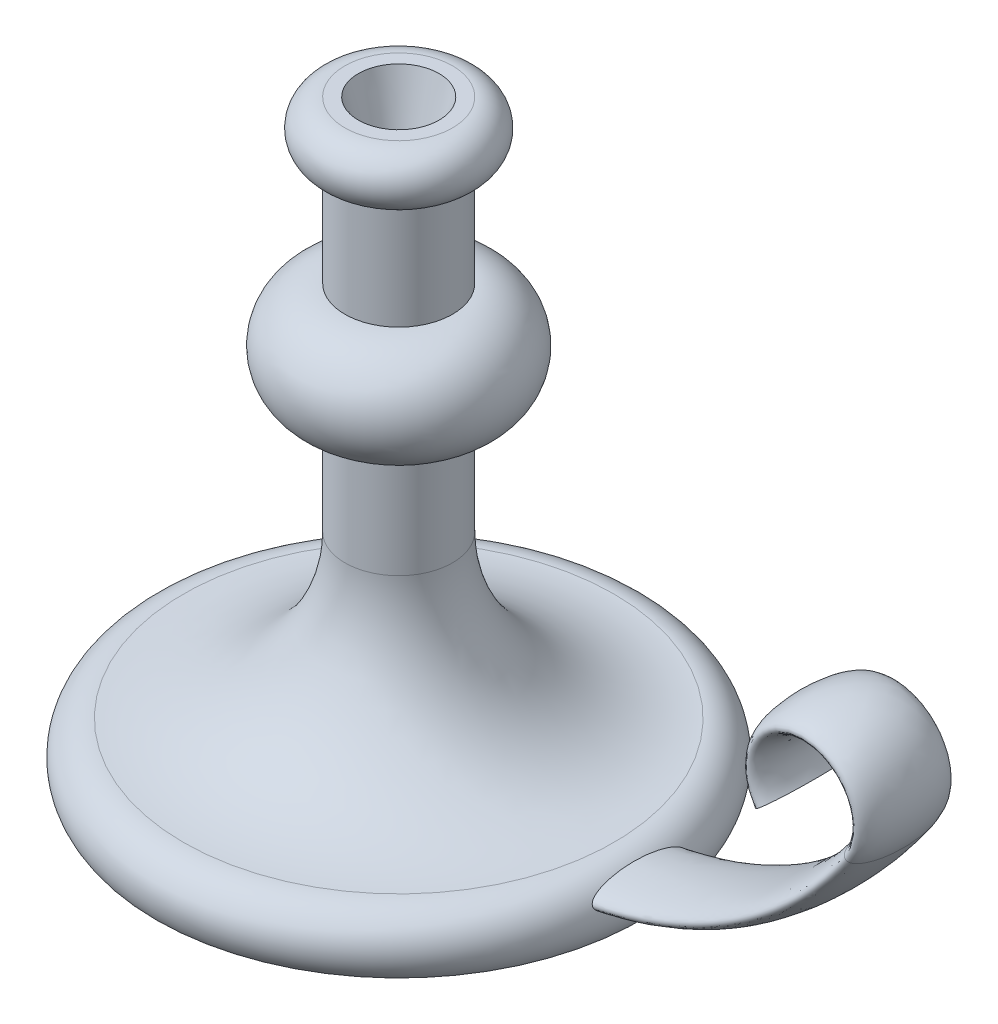
ISO-10303-21;
HEADER;
FILE_DESCRIPTION(('STEP AP214'),'2;1');
FILE_NAME('part.step','',(''),(''),'','','');
FILE_SCHEMA(('AUTOMOTIVE_DESIGN { 1 0 10303 214 1 1 1 1 }'));
ENDSEC;
DATA;
#1=APPLICATION_CONTEXT('core data for automotive mechanical design processes');
#2=APPLICATION_PROTOCOL_DEFINITION('international standard','automotive_design',2000,#1);
#3=PRODUCT_CONTEXT('',#1,'mechanical');
#4=PRODUCT('Part','Part','',(#3));
#5=PRODUCT_RELATED_PRODUCT_CATEGORY('part','',(#4));
#6=PRODUCT_DEFINITION_FORMATION('','',#4);
#7=PRODUCT_DEFINITION_CONTEXT('part definition',#1,'design');
#8=PRODUCT_DEFINITION('design','',#6,#7);
#9=PRODUCT_DEFINITION_SHAPE('','',#8);
#10=(LENGTH_UNIT() NAMED_UNIT(*) SI_UNIT(.MILLI.,.METRE.));
#11=(NAMED_UNIT(*) PLANE_ANGLE_UNIT() SI_UNIT($,.RADIAN.));
#12=(NAMED_UNIT(*) SI_UNIT($,.STERADIAN.) SOLID_ANGLE_UNIT());
#13=UNCERTAINTY_MEASURE_WITH_UNIT(LENGTH_MEASURE(1.E-05),#10,'distance_accuracy_value','');
#14=(GEOMETRIC_REPRESENTATION_CONTEXT(3) GLOBAL_UNCERTAINTY_ASSIGNED_CONTEXT((#13)) GLOBAL_UNIT_ASSIGNED_CONTEXT((#10,
#11,#12)) REPRESENTATION_CONTEXT('',''));
#15=CARTESIAN_POINT('',(0.,0.,0.));
#16=DIRECTION('',(0.,0.,1.));
#17=DIRECTION('',(1.,0.,0.));
#18=AXIS2_PLACEMENT_3D('',#15,#16,#17);
#19=CARTESIAN_POINT('',(0.,0.,0.));
#20=DIRECTION('',(0.,-1.,0.));
#21=DIRECTION('',(0.,0.,-1.));
#22=AXIS2_PLACEMENT_3D('',#19,#20,#21);
#23=PLANE('',#22);
#24=CARTESIAN_POINT('',(0.,0.,0.));
#25=DIRECTION('',(0.,-1.,0.));
#26=DIRECTION('',(0.,0.,-1.));
#27=AXIS2_PLACEMENT_3D('',#24,#25,#26);
#28=CIRCLE('',#27,90.);
#29=CARTESIAN_POINT('',(0.,0.,-90.));
#30=VERTEX_POINT('',#29);
#31=EDGE_CURVE('E83',#30,#30,#28,.T.);
#32=ORIENTED_EDGE('',*,*,#31,.T.);
#33=EDGE_LOOP('',(#32));
#34=FACE_BOUND('',#33,.T.);
#35=ADVANCED_FACE('F50',(#34),#23,.T.);
#36=CARTESIAN_POINT('',(0.,220.,0.));
#37=DIRECTION('',(0.,1.,0.));
#38=DIRECTION('',(0.,0.,1.));
#39=AXIS2_PLACEMENT_3D('',#36,#37,#38);
#40=PLANE('',#39);
#41=CARTESIAN_POINT('',(0.,220.,0.));
#42=DIRECTION('',(0.,1.,0.));
#43=DIRECTION('',(0.,0.,1.));
#44=AXIS2_PLACEMENT_3D('',#41,#42,#43);
#45=CIRCLE('',#44,15.);
#46=CARTESIAN_POINT('',(0.,220.,15.));
#47=VERTEX_POINT('',#46);
#48=EDGE_CURVE('E95',#47,#47,#45,.T.);
#49=ORIENTED_EDGE('',*,*,#48,.F.);
#50=EDGE_LOOP('',(#49));
#51=FACE_BOUND('',#50,.T.);
#52=CARTESIAN_POINT('',(0.,220.,0.));
#53=DIRECTION('',(0.,-1.,0.));
#54=DIRECTION('',(0.,0.,-1.));
#55=AXIS2_PLACEMENT_3D('',#52,#53,#54);
#56=CIRCLE('',#55,20.);
#57=CARTESIAN_POINT('',(0.,220.,-20.));
#58=VERTEX_POINT('',#57);
#59=EDGE_CURVE('E61',#58,#58,#56,.T.);
#60=ORIENTED_EDGE('',*,*,#59,.F.);
#61=EDGE_LOOP('',(#60));
#62=FACE_BOUND('',#61,.T.);
#63=ADVANCED_FACE('F101',(#51,#62),#40,.T.);
#64=CARTESIAN_POINT('',(0.,210.,0.));
#65=DIRECTION('',(0.,-1.,0.));
#66=DIRECTION('',(0.,0.,-1.));
#67=AXIS2_PLACEMENT_3D('',#64,#65,#66);
#68=TOROIDAL_SURFACE('',#67,20.,10.);
#69=ORIENTED_EDGE('',*,*,#59,.T.);
#70=EDGE_LOOP('',(#69));
#71=FACE_BOUND('',#70,.T.);
#72=CARTESIAN_POINT('',(0.,200.,0.));
#73=DIRECTION('',(0.,-1.,0.));
#74=DIRECTION('',(0.,0.,-1.));
#75=AXIS2_PLACEMENT_3D('',#72,#73,#74);
#76=CIRCLE('',#75,20.);
#77=CARTESIAN_POINT('',(0.,200.,-20.));
#78=VERTEX_POINT('',#77);
#79=EDGE_CURVE('E65',#78,#78,#76,.T.);
#80=ORIENTED_EDGE('',*,*,#79,.F.);
#81=EDGE_LOOP('',(#80));
#82=FACE_BOUND('',#81,.T.);
#83=ADVANCED_FACE('F104',(#71,#82),#68,.T.);
#84=CARTESIAN_POINT('',(0.,0.,0.));
#85=DIRECTION('',(0.,-1.,0.));
#86=DIRECTION('',(0.,0.,-1.));
#87=AXIS2_PLACEMENT_3D('',#84,#85,#86);
#88=CYLINDRICAL_SURFACE('',#87,20.);
#89=ORIENTED_EDGE('',*,*,#79,.T.);
#90=EDGE_LOOP('',(#89));
#91=FACE_BOUND('',#90,.T.);
#92=CARTESIAN_POINT('',(0.,160.,0.));
#93=DIRECTION('',(0.,-1.,0.));
#94=DIRECTION('',(0.,0.,-1.));
#95=AXIS2_PLACEMENT_3D('',#92,#93,#94);
#96=CIRCLE('',#95,20.);
#97=CARTESIAN_POINT('',(0.,160.,-20.));
#98=VERTEX_POINT('',#97);
#99=EDGE_CURVE('E69',#98,#98,#96,.T.);
#100=ORIENTED_EDGE('',*,*,#99,.F.);
#101=EDGE_LOOP('',(#100));
#102=FACE_BOUND('',#101,.T.);
#103=ADVANCED_FACE('F109',(#91,#102),#88,.T.);
#104=CARTESIAN_POINT('',(0.,140.,0.));
#105=DIRECTION('',(0.,-1.,0.));
#106=DIRECTION('',(0.,0.,-1.));
#107=AXIS2_PLACEMENT_3D('',#104,#105,#106);
#108=TOROIDAL_SURFACE('',#107,20.,20.);
#109=ORIENTED_EDGE('',*,*,#99,.T.);
#110=EDGE_LOOP('',(#109));
#111=FACE_BOUND('',#110,.T.);
#112=CARTESIAN_POINT('',(0.,120.,0.));
#113=DIRECTION('',(0.,-1.,0.));
#114=DIRECTION('',(0.,0.,-1.));
#115=AXIS2_PLACEMENT_3D('',#112,#113,#114);
#116=CIRCLE('',#115,20.);
#117=CARTESIAN_POINT('',(0.,120.,-20.));
#118=VERTEX_POINT('',#117);
#119=EDGE_CURVE('E74',#118,#118,#116,.T.);
#120=ORIENTED_EDGE('',*,*,#119,.F.);
#121=EDGE_LOOP('',(#120));
#122=FACE_BOUND('',#121,.T.);
#123=ADVANCED_FACE('F115',(#111,#122),#108,.T.);
#124=CARTESIAN_POINT('',(0.,0.,0.));
#125=DIRECTION('',(0.,-1.,0.));
#126=DIRECTION('',(0.,0.,-1.));
#127=AXIS2_PLACEMENT_3D('',#124,#125,#126);
#128=CYLINDRICAL_SURFACE('',#127,20.);
#129=ORIENTED_EDGE('',*,*,#119,.T.);
#130=EDGE_LOOP('',(#129));
#131=FACE_BOUND('',#130,.T.);
#132=CARTESIAN_POINT('',(0.,80.,0.));
#133=DIRECTION('',(0.,-1.,0.));
#134=DIRECTION('',(0.,0.,-1.));
#135=AXIS2_PLACEMENT_3D('',#132,#133,#134);
#136=CIRCLE('',#135,20.);
#137=CARTESIAN_POINT('',(0.,80.,-20.));
#138=VERTEX_POINT('',#137);
#139=EDGE_CURVE('E77',#138,#138,#136,.T.);
#140=ORIENTED_EDGE('',*,*,#139,.F.);
#141=EDGE_LOOP('',(#140));
#142=FACE_BOUND('',#141,.T.);
#143=ADVANCED_FACE('F119',(#131,#142),#128,.T.);
#144=CARTESIAN_POINT('',(0.,80.,0.));
#145=DIRECTION('',(0.,-1.,0.));
#146=DIRECTION('',(0.,0.,-1.));
#147=AXIS2_PLACEMENT_3D('',#144,#145,#146);
#148=TOROIDAL_SURFACE('',#147,80.,60.);
#149=ORIENTED_EDGE('',*,*,#139,.T.);
#150=EDGE_LOOP('',(#149));
#151=FACE_BOUND('',#150,.T.);
#152=CARTESIAN_POINT('',(0.,20.,0.));
#153=DIRECTION('',(0.,-1.,0.));
#154=DIRECTION('',(0.,0.,-1.));
#155=AXIS2_PLACEMENT_3D('',#152,#153,#154);
#156=CIRCLE('',#155,80.);
#157=CARTESIAN_POINT('',(0.,20.,-80.));
#158=VERTEX_POINT('',#157);
#159=EDGE_CURVE('E80',#158,#158,#156,.T.);
#160=ORIENTED_EDGE('',*,*,#159,.F.);
#161=EDGE_LOOP('',(#160));
#162=FACE_BOUND('',#161,.T.);
#163=ADVANCED_FACE('F123',(#151,#162),#148,.F.);
#164=CARTESIAN_POINT('',(0.,7.49999999999999,0.));
#165=DIRECTION('',(0.,-1.,0.));
#166=DIRECTION('',(0.,0.,-1.));
#167=AXIS2_PLACEMENT_3D('',#164,#165,#166);
#168=TOROIDAL_SURFACE('',#167,80.,12.5);
#169=CARTESIAN_POINT('',(89.5597422043341,12.9414346567555,-17.5));
#170=CARTESIAN_POINT('',(89.5390618403561,12.9834100865229,-17.4999996776707));
#171=CARTESIAN_POINT('',(89.5184817634659,13.0254349004937,-17.4978446678338));
#172=CARTESIAN_POINT('',(89.4776811982743,13.1092324497794,-17.4892861575811));
#173=CARTESIAN_POINT('',(89.457460843071,13.1510050881611,-17.4828811168849));
#174=CARTESIAN_POINT('',(89.3975402811209,13.2754779151414,-17.4575154450276));
#175=CARTESIAN_POINT('',(89.3585808220613,13.357332519418,-17.4324042670614));
#176=CARTESIAN_POINT('',(89.2734407804368,13.5379179993389,-17.3597430943198));
#177=CARTESIAN_POINT('',(89.2281116968574,13.6353152430682,-17.3079906529225));
#178=CARTESIAN_POINT('',(89.1421567137609,13.8217570109409,-17.1881654215547));
#179=CARTESIAN_POINT('',(89.10154096816,13.9107834263932,-17.1200583326704));
#180=CARTESIAN_POINT('',(89.0298799325305,14.0690063055582,-16.9825317839868));
#181=CARTESIAN_POINT('',(88.9982856031081,14.1392491335227,-16.9145677994464));
#182=CARTESIAN_POINT('',(88.9378435588022,14.2742914925202,-16.7722502997375));
#183=CARTESIAN_POINT('',(88.9089980734781,14.3390866000317,-16.6978916893925));
#184=CARTESIAN_POINT('',(88.8536099995593,14.4639626152392,-16.544217780153));
#185=CARTESIAN_POINT('',(88.8270733532936,14.5240313225779,-16.4648905452803));
#186=CARTESIAN_POINT('',(88.7760376587063,14.6398576639347,-16.3025863942461));
#187=CARTESIAN_POINT('',(88.7515379613228,14.6956166708123,-16.219610653644));
#188=CARTESIAN_POINT('',(88.7047328205489,14.8023169553036,-16.052427362784));
#189=CARTESIAN_POINT('',(88.6823939519366,14.8533308765833,-15.9682752160745));
#190=CARTESIAN_POINT('',(88.639155365759,14.9521540950118,-15.7977416210759));
#191=CARTESIAN_POINT('',(88.6182558899721,14.9999628537458,-15.711359801597));
#192=CARTESIAN_POINT('',(88.5573681790008,15.1392585624723,-15.4492483073625));
#193=CARTESIAN_POINT('',(88.5192579811327,15.2264609786255,-15.2707999543232));
#194=CARTESIAN_POINT('',(88.4468979005836,15.3916731276291,-14.9088289385944));
#195=CARTESIAN_POINT('',(88.4126513155026,15.4696750103546,-14.725302105289));
#196=CARTESIAN_POINT('',(88.3471391595039,15.6182965032923,-14.3538259785736));
#197=CARTESIAN_POINT('',(88.3158872528146,15.6888824046966,-14.1658608782527));
#198=CARTESIAN_POINT('',(88.2560127035516,15.8233792512431,-13.7874003918539));
#199=CARTESIAN_POINT('',(88.2273872233002,15.8872974109117,-13.5969079973402));
#200=CARTESIAN_POINT('',(88.1723348827448,16.0094159388249,-13.213849673779));
#201=CARTESIAN_POINT('',(88.1459074726896,16.0676177374301,-13.021284276893));
#202=CARTESIAN_POINT('',(88.0884248304702,16.1932687928886,-12.5849658119247));
#203=CARTESIAN_POINT('',(88.0579162002184,16.2592725226906,-12.3407253521734));
#204=CARTESIAN_POINT('',(87.9994625659013,16.3844358500305,-11.8501803460781));
#205=CARTESIAN_POINT('',(87.9715178234088,16.4435947494061,-11.6038755919222));
#206=CARTESIAN_POINT('',(87.9178897421858,16.5558889779776,-11.1095299870479));
#207=CARTESIAN_POINT('',(87.8922075114269,16.6090213595568,-10.8614883492399));
#208=CARTESIAN_POINT('',(87.8429155378603,16.7098546386226,-10.3640943607017));
#209=CARTESIAN_POINT('',(87.8193058942811,16.7575552760879,-10.114741947821));
#210=CARTESIAN_POINT('',(87.7514718906047,16.8930622945828,-9.36631396644897));
#211=CARTESIAN_POINT('',(87.710111419914,16.97354616682,-8.86564202060311));
#212=CARTESIAN_POINT('',(87.6344118706353,17.1178657179368,-7.86153551840225));
#213=CARTESIAN_POINT('',(87.6000713341079,17.1817048544489,-7.35810155802561));
#214=CARTESIAN_POINT('',(87.5383679228554,17.2943697092708,-6.35225136111871));
#215=CARTESIAN_POINT('',(87.5109639050818,17.3432843238913,-5.84984753787554));
#216=CARTESIAN_POINT('',(87.4628391630611,17.4279603163538,-4.84354228831008));
#217=CARTESIAN_POINT('',(87.4421195253372,17.4637195559667,-4.33964063194088));
#218=CARTESIAN_POINT('',(87.4074386787954,17.5229738360405,-3.33084363886012));
#219=CARTESIAN_POINT('',(87.3934780874881,17.5464677559495,-2.8259482155868));
#220=CARTESIAN_POINT('',(87.3724154174235,17.5817273168609,-1.81615213380802));
#221=CARTESIAN_POINT('',(87.3653059747339,17.5935055508652,-1.3112520655452));
#222=CARTESIAN_POINT('',(87.3579750479624,17.6056484066489,-0.301318309132904));
#223=CARTESIAN_POINT('',(87.357752858235,17.6060141977103,0.203715360026094));
#224=CARTESIAN_POINT('',(87.3641963426438,17.5953454261038,1.21356726554169));
#225=CARTESIAN_POINT('',(87.3708612610896,17.5843121142069,1.71838551945508));
#226=CARTESIAN_POINT('',(87.3886163883338,17.554616306541,2.60695068649852));
#227=CARTESIAN_POINT('',(87.3982690399212,17.5384060734754,2.99081046478838));
#228=CARTESIAN_POINT('',(87.4214966880659,17.4990063104014,3.75807002785711));
#229=CARTESIAN_POINT('',(87.435071823598,17.4758165331044,4.14146979585427));
#230=CARTESIAN_POINT('',(87.4661109016121,17.4221255760208,4.90767543763208));
#231=CARTESIAN_POINT('',(87.4835755913649,17.3916229911934,5.29048118303758));
#232=CARTESIAN_POINT('',(87.5224765269599,17.3226675403927,6.05728766608034));
#233=CARTESIAN_POINT('',(87.5439339089184,17.2841722314846,6.44128353835439));
#234=CARTESIAN_POINT('',(87.5907685418077,17.1987228636429,7.20803081067555));
#235=CARTESIAN_POINT('',(87.6161451191905,17.1517702579396,7.59078241304229));
#236=CARTESIAN_POINT('',(87.6708875244928,17.0486132676472,8.35453102594113));
#237=CARTESIAN_POINT('',(87.7002509792864,16.9924143825779,8.73552894189134));
#238=CARTESIAN_POINT('',(87.7555693385741,16.8844873931684,9.40362807317344));
#239=CARTESIAN_POINT('',(87.7806318626291,16.8349635590469,9.6911595586556));
#240=CARTESIAN_POINT('',(87.8333287645207,16.7293167465828,10.2648242071222));
#241=CARTESIAN_POINT('',(87.8609635304672,16.6731927720484,10.5509571522122));
#242=CARTESIAN_POINT('',(87.9190678138249,16.5534902310351,11.1217112831612));
#243=CARTESIAN_POINT('',(87.9495404231884,16.4899035134826,11.4063304543324));
#244=CARTESIAN_POINT('',(88.0137266324375,16.3541216812727,11.9738772339476));
#245=CARTESIAN_POINT('',(88.0474477220507,16.2819065762202,12.2567992545898));
#246=CARTESIAN_POINT('',(88.1183718381953,16.1280994435204,12.8175821097588));
#247=CARTESIAN_POINT('',(88.1555499028383,16.046573796357,13.0954641920682));
#248=CARTESIAN_POINT('',(88.2343580118385,15.8719007074313,13.6468218234687));
#249=CARTESIAN_POINT('',(88.2759857295858,15.7787593350285,13.9202995902182));
#250=CARTESIAN_POINT('',(88.3426568223939,15.6283840406489,14.3254052817092));
#251=CARTESIAN_POINT('',(88.3655500017785,15.5765627213432,14.459402316928));
#252=CARTESIAN_POINT('',(88.4129882653633,15.4688611687535,14.7254525655375));
#253=CARTESIAN_POINT('',(88.437533168995,15.4129813790936,14.8575059894887));
#254=CARTESIAN_POINT('',(88.4884967907572,15.296726972035,15.1188747284343));
#255=CARTESIAN_POINT('',(88.5149109123158,15.2363633637366,15.2481958098579));
#256=CARTESIAN_POINT('',(88.5700241751771,15.1103179001212,15.5037035642081));
#257=CARTESIAN_POINT('',(88.5987227483178,15.0446373670989,15.6298910063173));
#258=CARTESIAN_POINT('',(88.6570151826478,14.9113179601609,15.8704199707059));
#259=CARTESIAN_POINT('',(88.686441736786,14.8440563407289,15.985009599526));
#260=CARTESIAN_POINT('',(88.7482816567767,14.7030103830826,16.2094581395952));
#261=CARTESIAN_POINT('',(88.780697475614,14.6292206899981,16.3193130551168));
#262=CARTESIAN_POINT('',(88.8489097184972,14.4745639616531,16.5315146626623));
#263=CARTESIAN_POINT('',(88.8846785573508,14.3937550191611,16.6339121024916));
#264=CARTESIAN_POINT('',(88.9606113704152,14.2232561160766,16.8291907541922));
#265=CARTESIAN_POINT('',(89.0007675950252,14.1335818404865,16.9220882016582));
#266=CARTESIAN_POINT('',(89.0601235459872,14.0021924630805,17.0411637727684));
#267=CARTESIAN_POINT('',(89.0770574086404,13.9648250339927,17.0732949178269));
#268=CARTESIAN_POINT('',(89.1117704043089,13.8885105828123,17.1351129203988));
#269=CARTESIAN_POINT('',(89.1295494801998,13.8495636674962,17.1647999427301));
#270=CARTESIAN_POINT('',(89.1842722230347,13.7301865324198,17.2496672583031));
#271=CARTESIAN_POINT('',(89.2225929343976,13.6472387371287,17.3006362954166));
#272=CARTESIAN_POINT('',(89.2830198855204,13.5177923286577,17.3659392171784));
#273=CARTESIAN_POINT('',(89.3038035106325,13.4734899832391,17.385944655127));
#274=CARTESIAN_POINT('',(89.346235727213,13.3835498526412,17.421521231844));
#275=CARTESIAN_POINT('',(89.3678838017235,13.3379128698458,17.4370949768747));
#276=CARTESIAN_POINT('',(89.411904802424,13.2456714845448,17.4633118273198));
#277=CARTESIAN_POINT('',(89.4342765183816,13.1990687398024,17.4739627514632));
#278=CARTESIAN_POINT('',(89.4796070415906,13.1052444737537,17.4900003628641));
#279=CARTESIAN_POINT('',(89.5025657624808,13.0580230439623,17.495387819971));
#280=CARTESIAN_POINT('',(89.5464271716018,12.9684112208445,17.5004320668286));
#281=CARTESIAN_POINT('',(89.5672934245651,12.9260327119426,17.5006298436875));
#282=CARTESIAN_POINT('',(89.6091580078856,12.8415284156484,17.496667300483));
#283=CARTESIAN_POINT('',(89.6301563797468,12.7994027167221,17.4925055351934));
#284=CARTESIAN_POINT('',(89.672115635143,12.7157496198108,17.479965082583));
#285=CARTESIAN_POINT('',(89.6930765014329,12.6742224548788,17.4715847960013));
#286=CARTESIAN_POINT('',(89.7348115258834,12.5920532516239,17.4508625220261));
#287=CARTESIAN_POINT('',(89.7555855765781,12.5514117057388,17.4385183877269));
#288=CARTESIAN_POINT('',(89.8013847331777,12.4623676182577,17.4070626989759));
#289=CARTESIAN_POINT('',(89.8263321178974,12.4142402057079,17.3870577635768));
#290=CARTESIAN_POINT('',(89.8756026524762,12.3198942829529,17.3423007335128));
#291=CARTESIAN_POINT('',(89.8999253272692,12.2736772101064,17.317545140678));
#292=CARTESIAN_POINT('',(89.9718636752115,12.1379719567039,17.2371059859825));
#293=CARTESIAN_POINT('',(90.0184026508768,12.051520920799,17.1752845379973));
#294=CARTESIAN_POINT('',(90.1015176697337,11.8991704299987,17.0502729237444));
#295=CARTESIAN_POINT('',(90.1385373685484,11.832138329749,16.9886971231214));
#296=CARTESIAN_POINT('',(90.2104869329279,11.7032426034952,16.8591573255862));
#297=CARTESIAN_POINT('',(90.2454151408799,11.641383062009,16.7911883686367));
#298=CARTESIAN_POINT('',(90.3133841124365,11.5222099067343,16.6502911436158));
#299=CARTESIAN_POINT('',(90.3464212107124,11.4649050425,16.577353807455));
#300=CARTESIAN_POINT('',(90.4107258034174,11.3544143267812,16.427734996584));
#301=CARTESIAN_POINT('',(90.441993749758,11.3012274221163,16.3510544874358));
#302=CARTESIAN_POINT('',(90.5066142435688,11.1922810586096,16.185318952537));
#303=CARTESIAN_POINT('',(90.5397652495639,11.1369814833086,16.0958847835331));
#304=CARTESIAN_POINT('',(90.6043042941241,11.0303194621557,15.9140859303206));
#305=CARTESIAN_POINT('',(90.6356921559875,10.978957410734,15.8217209538336));
#306=CARTESIAN_POINT('',(90.696838387797,10.8797698841651,15.6347974994414));
#307=CARTESIAN_POINT('',(90.7265992701636,10.8319389137698,15.540242744142));
#308=CARTESIAN_POINT('',(90.7846969346251,10.7393295137681,15.3492353522605));
#309=CARTESIAN_POINT('',(90.8130337948203,10.6945509167066,15.2527828201664));
#310=CARTESIAN_POINT('',(90.8771212205239,10.5940589597549,15.0277319837683));
#311=CARTESIAN_POINT('',(90.9124022819657,10.5393328792865,14.8985593440141));
#312=CARTESIAN_POINT('',(90.9809741103801,10.4339610325184,14.6380328432609));
#313=CARTESIAN_POINT('',(91.0142645951402,10.3833158444317,14.5066786763347));
#314=CARTESIAN_POINT('',(91.1115171918212,10.2366440116077,14.1096810918781));
#315=CARTESIAN_POINT('',(91.1727828792965,10.1460018602114,13.8413800425919));
#316=CARTESIAN_POINT('',(91.289286281246,9.97615455726914,13.2997906638459));
#317=CARTESIAN_POINT('',(91.3445203789087,9.89695625887038,13.0264994554536));
#318=CARTESIAN_POINT('',(91.449980571998,9.74769654866267,12.4748594155948));
#319=CARTESIAN_POINT('',(91.5001780442572,9.6776867307802,12.1964912536698));
#320=CARTESIAN_POINT('',(91.5957501918067,9.54592534416388,11.6372393425744));
#321=CARTESIAN_POINT('',(91.6411285723793,9.48416742117631,11.3563577087906));
#322=CARTESIAN_POINT('',(91.7275132616963,9.36779787162549,10.7925089006676));
#323=CARTESIAN_POINT('',(91.7685202729419,9.31318509647924,10.5095420692682));
#324=CARTESIAN_POINT('',(91.8503345045436,9.20520508711807,9.91387150213599));
#325=CARTESIAN_POINT('',(91.8907217744488,9.15249390095813,9.60099168323579));
#326=CARTESIAN_POINT('',(91.9669218199109,9.05389158705534,8.97359688181915));
#327=CARTESIAN_POINT('',(92.002734366163,9.00800080116139,8.6590818181589));
#328=CARTESIAN_POINT('',(92.07003298894,8.92240020575308,8.02865568808724));
#329=CARTESIAN_POINT('',(92.1015177516249,8.88269227276197,7.7127442276644));
#330=CARTESIAN_POINT('',(92.1603325838502,8.80898713679307,7.07986626810557));
#331=CARTESIAN_POINT('',(92.1876625005419,8.77499014390502,6.76289973059346));
#332=CARTESIAN_POINT('',(92.263503001365,8.681142739021,5.81249868362183));
#333=CARTESIAN_POINT('',(92.3060517448553,8.62919999492193,5.17778747193807));
#334=CARTESIAN_POINT('',(92.3760091017524,8.54431318450691,3.90627938186788));
#335=CARTESIAN_POINT('',(92.4034169750228,8.51137004695188,3.26948240305251));
#336=CARTESIAN_POINT('',(92.4435085691827,8.46331702284119,1.99545741778409));
#337=CARTESIAN_POINT('',(92.4562084043365,8.44818761908847,1.35823064985384));
#338=CARTESIAN_POINT('',(92.4671302630246,8.43517103988552,0.0834423270811996));
#339=CARTESIAN_POINT('',(92.4653514271759,8.43728488791032,-0.554119245387659));
#340=CARTESIAN_POINT('',(92.4472853754492,8.4588334475092,-1.82886328296945));
#341=CARTESIAN_POINT('',(92.4309954438924,8.47827140120326,-2.46604565478056));
#342=CARTESIAN_POINT('',(92.3836590626409,8.53514174464791,-3.73902583866963));
#343=CARTESIAN_POINT('',(92.3526140808133,8.57257234445216,-4.37482378215462));
#344=CARTESIAN_POINT('',(92.2921790866404,8.64621329194991,-5.36625544460937));
#345=CARTESIAN_POINT('',(92.2680118235609,8.67578736963475,-5.72271555901825));
#346=CARTESIAN_POINT('',(92.2147013952355,8.74146404735385,-6.43465819603256));
#347=CARTESIAN_POINT('',(92.1855583836333,8.77756644580531,-6.79014074847936));
#348=CARTESIAN_POINT('',(92.1221127048893,8.85679311513343,-7.49983836059438));
#349=CARTESIAN_POINT('',(92.0878103957549,8.89991689880816,-7.85405350646421));
#350=CARTESIAN_POINT('',(92.013798122625,8.99384143269643,-8.56089767223875));
#351=CARTESIAN_POINT('',(91.9740883343958,9.04464193338973,-8.91352674331298));
#352=CARTESIAN_POINT('',(91.9015818240063,9.13842562293709,-9.51226790233073));
#353=CARTESIAN_POINT('',(91.8702370654071,9.17924629619428,-9.7588957593416));
#354=CARTESIAN_POINT('',(91.8045624920058,9.26550036635904,-10.2509419620298));
#355=CARTESIAN_POINT('',(91.770232756707,9.31093364041761,-10.4963603397372));
#356=CARTESIAN_POINT('',(91.6984266463272,9.40685898724873,-10.9855805665733));
#357=CARTESIAN_POINT('',(91.6609523533817,9.45734771681957,-11.2293833718164));
#358=CARTESIAN_POINT('',(91.5826038967892,9.56401317099017,-11.7151775621045));
#359=CARTESIAN_POINT('',(91.5417298772536,9.62018965451306,-11.9571690234572));
#360=CARTESIAN_POINT('',(91.4386423376746,9.76351210996375,-12.5384162018481));
#361=CARTESIAN_POINT('',(91.3745858903288,9.85386844470737,-12.8765786557769));
#362=CARTESIAN_POINT('',(91.2720163238267,10.0014015523806,-13.3793136041309));
#363=CARTESIAN_POINT('',(91.2367090969992,10.0526332971693,-13.5462966135005));
#364=CARTESIAN_POINT('',(91.1637294936457,10.1596261841618,-13.8782853379553));
#365=CARTESIAN_POINT('',(91.1260572231721,10.2153871233018,-14.0432911413072));
#366=CARTESIAN_POINT('',(91.0448513753997,10.3369382727868,-14.3844416693127));
#367=CARTESIAN_POINT('',(91.0010908407915,10.4031767890597,-14.5603739146113));
#368=CARTESIAN_POINT('',(90.9100440331646,10.5428509324198,-14.908531165983));
#369=CARTESIAN_POINT('',(90.8627565865346,10.6162889577863,-15.0807549132312));
#370=CARTESIAN_POINT('',(90.7642492199854,10.7715651970481,-15.4195496037302));
#371=CARTESIAN_POINT('',(90.7130423069867,10.8533759065568,-15.5861368065584));
#372=CARTESIAN_POINT('',(90.6058220172113,11.0275348916429,-15.9120386126948));
#373=CARTESIAN_POINT('',(90.5498128203452,11.119874025908,-16.0713593593323));
#374=CARTESIAN_POINT('',(90.4444082893051,11.2969255920341,-16.346591008204));
#375=CARTESIAN_POINT('',(90.3961277047704,11.3791055101425,-16.4645448336189));
#376=CARTESIAN_POINT('',(90.2950977924847,11.5538633486867,-16.6911566146551));
#377=CARTESIAN_POINT('',(90.242339056253,11.6464633011953,-16.7997939840166));
#378=CARTESIAN_POINT('',(90.1590440243456,11.7953014200273,-16.9524870890686));
#379=CARTESIAN_POINT('',(90.1303607600847,11.8469859215397,-17.0019977189781));
#380=CARTESIAN_POINT('',(90.0716181087375,11.953827456151,-17.0963102611099));
#381=CARTESIAN_POINT('',(90.0415584049394,12.0089852895524,-17.1411110817339));
#382=CARTESIAN_POINT('',(89.9801756575596,12.122724663209,-17.2246441347398));
#383=CARTESIAN_POINT('',(89.948857753765,12.1812926416249,-17.2633984155372));
#384=CARTESIAN_POINT('',(89.8849549671329,12.3020144005062,-17.3335784406431));
#385=CARTESIAN_POINT('',(89.8523712452274,12.3641649194655,-17.3650107233704));
#386=CARTESIAN_POINT('',(89.7981176909035,12.4687258013536,-17.4092508881815));
#387=CARTESIAN_POINT('',(89.7767436177655,12.5101841078545,-17.4246893204628));
#388=CARTESIAN_POINT('',(89.7336969050674,12.5942336377178,-17.4515182330193));
#389=CARTESIAN_POINT('',(89.7120243813912,12.6368244270179,-17.4629102408532));
#390=CARTESIAN_POINT('',(89.6685521390583,12.7228207531292,-17.4812886417918));
#391=CARTESIAN_POINT('',(89.6467526103346,12.766225219827,-17.488280453409));
#392=CARTESIAN_POINT('',(89.6031794397246,12.8535466229688,-17.4976362320133));
#393=CARTESIAN_POINT('',(89.5814057970822,12.8974635440192,-17.5000003376542));
#394=CARTESIAN_POINT('',(89.5597422043341,12.9414346567555,-17.5));
#395=B_SPLINE_CURVE_WITH_KNOTS('',3,(#169,#170,#171,#172,#173,#174,#175,#176,#177,#178,#179,
#180,#181,#182,#183,#184,#185,#186,#187,#188,#189,#190,#191,#192,#193,#194,#195,#196,#197,#198,
#199,#200,#201,#202,#203,#204,#205,#206,#207,#208,#209,#210,#211,#212,#213,#214,#215,#216,#217,
#218,#219,#220,#221,#222,#223,#224,#225,#226,#227,#228,#229,#230,#231,#232,#233,#234,#235,#236,
#237,#238,#239,#240,#241,#242,#243,#244,#245,#246,#247,#248,#249,#250,#251,#252,#253,#254,#255,
#256,#257,#258,#259,#260,#261,#262,#263,#264,#265,#266,#267,#268,#269,#270,#271,#272,#273,#274,
#275,#276,#277,#278,#279,#280,#281,#282,#283,#284,#285,#286,#287,#288,#289,#290,#291,#292,#293,
#294,#295,#296,#297,#298,#299,#300,#301,#302,#303,#304,#305,#306,#307,#308,#309,#310,#311,#312,
#313,#314,#315,#316,#317,#318,#319,#320,#321,#322,#323,#324,#325,#326,#327,#328,#329,#330,#331,
#332,#333,#334,#335,#336,#337,#338,#339,#340,#341,#342,#343,#344,#345,#346,#347,#348,#349,#350,
#351,#352,#353,#354,#355,#356,#357,#358,#359,#360,#361,#362,#363,#364,#365,#366,#367,#368,#369,
#370,#371,#372,#373,#374,#375,#376,#377,#378,#379,#380,#381,#382,#383,#384,#385,#386,#387,#388,
#389,#390,#391,#392,#393,#394),.UNSPECIFIED.,.T.,.F.,(4,2,2,2,2,2,2,2,2,2,2,2,2,2,2,2,2,2,2,2,2,
2,2,2,2,2,2,2,2,2,2,2,2,2,2,2,2,2,2,2,2,2,2,2,2,2,2,2,2,2,2,2,2,2,2,2,2,2,2,2,2,2,2,2,2,2,2,2,2,
2,2,2,2,2,2,2,2,2,2,2,2,2,2,2,2,2,2,2,2,2,2,2,2,2,2,2,2,2,2,2,2,2,2,2,2,2,2,2,2,2,2,2,4),(0.,
0.140326879649314,0.280704643844314,0.561461806499946,0.917225717585807,1.27374235386084,
1.58146302398147,1.88943119593642,2.19816989275475,2.50680983170026,2.80944292372749,
3.11212672643256,3.71838915770193,4.32516518168246,4.93458970782543,5.54334784093536,
6.15195325906648,6.91631911029045,7.68076285707087,8.44557890144726,9.21043154271131,
10.7363530227227,12.2619572680851,13.7782885580523,15.2948661984783,16.8115823682402,
18.3266664767785,19.8415953542035,21.3563580231468,22.5092504482307,23.6621837256808,
24.8153386988898,25.974781379963,27.1340250219354,28.2925816429424,29.1710242088838,
30.0495995331114,30.9291435591542,31.8107663507034,32.6864555684207,33.5616891298975,
33.9980703124477,34.4344038665402,34.8696994156046,35.3048870393029,35.7129485465613,
36.1213479397352,36.5266413619584,36.9312301321629,37.087481072601,37.2437214677037,
37.5562829439449,37.7147148343191,37.8730533580126,38.0311395270882,38.1892025705741,
38.3307149014328,38.4722741597123,38.6138871242241,38.7555769191151,38.9286541005773,
39.1018592207181,39.4485901352339,39.7429975955386,40.0376353818191,40.3328261359407,
40.6279411430422,40.9585479808935,41.2891878931729,41.6193018978016,41.949397777569,
42.3832551508599,42.8171738887969,43.6859467918768,44.5552378220701,45.4292182663362,
46.3025217875279,47.1756847521811,48.1351081860332,49.0945796914522,50.0543418354861,
51.0141392787933,52.9283366636011,54.8426276125084,56.7548192562812,58.6671243992163,
60.5797874956863,62.4922603557696,63.5676819321847,64.6430703071873,65.7183840946026,
66.7936629380623,67.5494303160602,68.305177570719,69.0604283053775,69.8156470419352,
70.8826765887351,71.4172057561797,71.9517109715327,72.5305894861726,73.1096614946433,
73.6868888443992,74.2636187787012,74.7180950553375,75.1735510009089,75.4046853668801,
75.6358731855895,75.8661972266865,76.0963147970917,76.2435550398534,76.3907396389802,
76.5377426347989,76.6847412260987),.UNSPECIFIED.);
#396=CARTESIAN_POINT('',(89.5597422043341,12.9414346567555,-17.5));
#397=VERTEX_POINT('',#396);
#398=EDGE_CURVE('E12',#397,#397,#395,.T.);
#399=ORIENTED_EDGE('',*,*,#398,.F.);
#400=EDGE_LOOP('',(#399));
#401=FACE_BOUND('',#400,.T.);
#402=ORIENTED_EDGE('',*,*,#159,.T.);
#403=EDGE_LOOP('',(#402));
#404=FACE_BOUND('',#403,.T.);
#405=ORIENTED_EDGE('',*,*,#31,.F.);
#406=EDGE_LOOP('',(#405));
#407=FACE_BOUND('',#406,.T.);
#408=ADVANCED_FACE('F126',(#401,#404,#407),#168,.T.);
#409=CARTESIAN_POINT('',(150.634185358261,75.,0.));
#410=DIRECTION('',(0.566666666666667,-0.823947139620552,0.));
#411=DIRECTION('',(0.,0.,-1.));
#412=AXIS2_PLACEMENT_3D('',#409,#410,#411);
#413=PLANE('',#412);
#414=CARTESIAN_POINT('',(150.634185358261,75.,0.));
#415=DIRECTION('',(0.566666666666667,-0.823947139620552,0.));
#416=DIRECTION('',(0.,0.,-1.));
#417=AXIS2_PLACEMENT_3D('',#414,#415,#416);
#418=ELLIPSE('',#417,17.5,5.);
#419=CARTESIAN_POINT('',(150.634185358261,75.,-17.5));
#420=VERTEX_POINT('',#419);
#421=EDGE_CURVE('E86',#420,#420,#418,.T.);
#422=ORIENTED_EDGE('',*,*,#421,.T.);
#423=EDGE_LOOP('',(#422));
#424=FACE_BOUND('',#423,.T.);
#425=ADVANCED_FACE('F131',(#424),#413,.T.);
#426=CARTESIAN_POINT('',(60.,10.,-17.5));
#427=CARTESIAN_POINT('',(110.410191303973,10.,-17.5));
#428=CARTESIAN_POINT('',(155.026295870831,33.4646670673665,-17.5));
#429=CARTESIAN_POINT('',(183.592070943083,75.,-17.5));
#430=CARTESIAN_POINT('',(60.,20.,-17.5));
#431=CARTESIAN_POINT('',(107.049511883708,20.,-17.5));
#432=CARTESIAN_POINT('',(148.691209479443,41.9003559295421,-17.5));
#433=CARTESIAN_POINT('',(175.352599546877,80.6666666666666,-17.5));
#434=CARTESIAN_POINT('',(60.,20.,17.5));
#435=CARTESIAN_POINT('',(107.049511883708,20.,17.5));
#436=CARTESIAN_POINT('',(148.691209479443,41.9003559295421,17.5));
#437=CARTESIAN_POINT('',(175.352599546877,80.6666666666666,17.5));
#438=CARTESIAN_POINT('',(60.,10.,17.5));
#439=CARTESIAN_POINT('',(110.410191303973,10.,17.5));
#440=CARTESIAN_POINT('',(155.026295870831,33.4646670673665,17.5));
#441=CARTESIAN_POINT('',(183.592070943083,75.,17.5));
#442=CARTESIAN_POINT('',(60.,0.,17.5));
#443=CARTESIAN_POINT('',(113.770870724238,0.,17.5));
#444=CARTESIAN_POINT('',(161.36138226222,25.0289782051909,17.5));
#445=CARTESIAN_POINT('',(191.831542339288,69.3333333333333,17.5));
#446=CARTESIAN_POINT('',(60.,0.,-17.5));
#447=CARTESIAN_POINT('',(113.770870724238,0.,-17.5));
#448=CARTESIAN_POINT('',(161.36138226222,25.0289782051909,-17.5));
#449=CARTESIAN_POINT('',(191.831542339288,69.3333333333333,-17.5));
#450=CARTESIAN_POINT('',(60.,10.,-17.5));
#451=CARTESIAN_POINT('',(110.410191303973,10.,-17.5));
#452=CARTESIAN_POINT('',(155.026295870831,33.4646670673665,-17.5));
#453=CARTESIAN_POINT('',(183.592070943083,75.,-17.5));
#454=(BOUNDED_SURFACE() B_SPLINE_SURFACE(3,3,((#426,#427,#428,#429),(#430,#431,#432,#433),(#434,
#435,#436,#437),(#438,#439,#440,#441),(#442,#443,#444,#445),(#446,#447,#448,#449),(#450,#451,
#452,#453)),.UNSPECIFIED.,.T.,.F.,.F.) B_SPLINE_SURFACE_WITH_KNOTS((4,3,4),(4,4),(0.,0.5,1.),
(0.,1.),.UNSPECIFIED.) GEOMETRIC_REPRESENTATION_ITEM() RATIONAL_B_SPLINE_SURFACE(((1.,
0.923374135437856,0.923374135437856,1.),(0.333333333333333,0.307791378479285,0.307791378479285,
0.333333333333333),(0.333333333333333,0.307791378479285,0.307791378479285,0.333333333333333),
(1.,0.923374135437856,0.923374135437856,1.),(0.333333333333333,0.307791378479285,
0.307791378479285,0.333333333333333),(0.333333333333333,0.307791378479285,0.307791378479285,
0.333333333333333),(1.,0.923374135437856,0.923374135437856,1.))) REPRESENTATION_ITEM('') SURFACE());
#455=CARTESIAN_POINT('',(183.592070943083,75.,0.));
#456=DIRECTION('',(0.566666666666667,0.823947139620552,0.));
#457=DIRECTION('',(0.,0.,-1.));
#458=AXIS2_PLACEMENT_3D('',#455,#456,#457);
#459=ELLIPSE('',#458,17.5,5.);
#460=CARTESIAN_POINT('',(183.592070943083,75.,-17.5));
#461=VERTEX_POINT('',#460);
#462=EDGE_CURVE('E89',#461,#461,#459,.T.);
#463=ORIENTED_EDGE('',*,*,#398,.T.);
#464=EDGE_LOOP('',(#463));
#465=FACE_BOUND('',#464,.T.);
#466=ORIENTED_EDGE('',*,*,#462,.F.);
#467=EDGE_LOOP('',(#466));
#468=FACE_BOUND('',#467,.T.);
#469=ADVANCED_FACE('F136',(#465,#468),#454,.T.);
#470=CARTESIAN_POINT('',(183.592070943083,75.,-17.5));
#471=CARTESIAN_POINT('',(193.981461744242,90.10642735238,-17.5));
#472=CARTESIAN_POINT('',(185.447347211541,106.333333333333,-17.5));
#473=CARTESIAN_POINT('',(167.113128150672,106.333333333333,-17.5));
#474=CARTESIAN_POINT('',(148.778909089802,106.333333333333,-17.5));
#475=CARTESIAN_POINT('',(140.244794557101,90.1064273523801,-17.5));
#476=CARTESIAN_POINT('',(150.634185358261,75.,-17.5));
#477=CARTESIAN_POINT('',(175.352599546877,80.6666666666667,-17.5));
#478=CARTESIAN_POINT('',(180.547294947457,88.2198803428567,-17.5));
#479=CARTESIAN_POINT('',(176.280237681107,96.3333333333333,-17.5));
#480=CARTESIAN_POINT('',(167.113128150672,96.3333333333333,-17.5));
#481=CARTESIAN_POINT('',(157.946018620237,96.3333333333334,-17.5));
#482=CARTESIAN_POINT('',(153.678961353887,88.2198803428568,-17.5));
#483=CARTESIAN_POINT('',(158.873656754466,80.6666666666667,-17.5));
#484=CARTESIAN_POINT('',(175.352599546877,80.6666666666667,17.5));
#485=CARTESIAN_POINT('',(180.547294947457,88.2198803428567,17.5));
#486=CARTESIAN_POINT('',(176.280237681107,96.3333333333333,17.5));
#487=CARTESIAN_POINT('',(167.113128150672,96.3333333333333,17.5));
#488=CARTESIAN_POINT('',(157.946018620237,96.3333333333334,17.5));
#489=CARTESIAN_POINT('',(153.678961353887,88.2198803428568,17.5));
#490=CARTESIAN_POINT('',(158.873656754466,80.6666666666667,17.5));
#491=CARTESIAN_POINT('',(183.592070943083,75.,17.5));
#492=CARTESIAN_POINT('',(193.981461744242,90.10642735238,17.5));
#493=CARTESIAN_POINT('',(185.447347211541,106.333333333333,17.5));
#494=CARTESIAN_POINT('',(167.113128150672,106.333333333333,17.5));
#495=CARTESIAN_POINT('',(148.778909089802,106.333333333333,17.5));
#496=CARTESIAN_POINT('',(140.244794557101,90.1064273523801,17.5));
#497=CARTESIAN_POINT('',(150.634185358261,75.,17.5));
#498=CARTESIAN_POINT('',(191.831542339288,69.3333333333333,17.5));
#499=CARTESIAN_POINT('',(207.415628541027,91.9929743619034,17.5));
#500=CARTESIAN_POINT('',(194.614456741976,116.333333333333,17.5));
#501=CARTESIAN_POINT('',(167.113128150672,116.333333333333,17.5));
#502=CARTESIAN_POINT('',(139.611799559367,116.333333333333,17.5));
#503=CARTESIAN_POINT('',(126.810627760316,91.9929743619035,17.5));
#504=CARTESIAN_POINT('',(142.394713962055,69.3333333333334,17.5));
#505=CARTESIAN_POINT('',(191.831542339288,69.3333333333333,-17.5));
#506=CARTESIAN_POINT('',(207.415628541027,91.9929743619034,-17.5));
#507=CARTESIAN_POINT('',(194.614456741976,116.333333333333,-17.5));
#508=CARTESIAN_POINT('',(167.113128150672,116.333333333333,-17.5));
#509=CARTESIAN_POINT('',(139.611799559367,116.333333333333,-17.5));
#510=CARTESIAN_POINT('',(126.810627760316,91.9929743619035,-17.5));
#511=CARTESIAN_POINT('',(142.394713962055,69.3333333333334,-17.5));
#512=CARTESIAN_POINT('',(183.592070943083,75.,-17.5));
#513=CARTESIAN_POINT('',(193.981461744242,90.10642735238,-17.5));
#514=CARTESIAN_POINT('',(185.447347211541,106.333333333333,-17.5));
#515=CARTESIAN_POINT('',(167.113128150672,106.333333333333,-17.5));
#516=CARTESIAN_POINT('',(148.778909089802,106.333333333333,-17.5));
#517=CARTESIAN_POINT('',(140.244794557101,90.1064273523801,-17.5));
#518=CARTESIAN_POINT('',(150.634185358261,75.,-17.5));
#519=(BOUNDED_SURFACE() B_SPLINE_SURFACE(3,3,((#470,#471,#472,#473,#474,#475,#476),(#477,#478,
#479,#480,#481,#482,#483),(#484,#485,#486,#487,#488,#489,#490),(#491,#492,#493,#494,#495,#496,
#497),(#498,#499,#500,#501,#502,#503,#504),(#505,#506,#507,#508,#509,#510,#511),(#512,#513,#514,
#515,#516,#517,#518)),.UNSPECIFIED.,.T.,.F.,.F.) B_SPLINE_SURFACE_WITH_KNOTS((4,3,4),(4,3,4),
(0.,0.5,1.),(0.,0.5,1.),
.UNSPECIFIED.) GEOMETRIC_REPRESENTATION_ITEM() RATIONAL_B_SPLINE_SURFACE(((1.,0.64364977875042,
0.64364977875042,1.,0.64364977875042,0.64364977875042,1.),(0.333333333333333,0.21454992625014,
0.21454992625014,0.333333333333333,0.21454992625014,0.21454992625014,0.333333333333333),
(0.333333333333333,0.21454992625014,0.21454992625014,0.333333333333333,0.21454992625014,
0.21454992625014,0.333333333333333),(1.,0.64364977875042,0.64364977875042,1.,0.64364977875042,
0.64364977875042,1.),(0.333333333333333,0.21454992625014,0.21454992625014,0.333333333333333,
0.21454992625014,0.21454992625014,0.333333333333333),(0.333333333333333,0.21454992625014,
0.21454992625014,0.333333333333333,0.21454992625014,0.21454992625014,0.333333333333333),(1.,
0.64364977875042,0.64364977875042,1.,0.64364977875042,0.64364977875042,1.))) REPRESENTATION_ITEM('') SURFACE());
#520=ORIENTED_EDGE('',*,*,#421,.F.);
#521=EDGE_LOOP('',(#520));
#522=FACE_BOUND('',#521,.T.);
#523=ORIENTED_EDGE('',*,*,#462,.T.);
#524=EDGE_LOOP('',(#523));
#525=FACE_BOUND('',#524,.T.);
#526=ADVANCED_FACE('F133',(#522,#525),#519,.T.);
#527=CARTESIAN_POINT('',(0.,220.,0.));
#528=DIRECTION('',(0.,1.,0.));
#529=DIRECTION('',(0.,0.,1.));
#530=AXIS2_PLACEMENT_3D('',#527,#528,#529);
#531=CONICAL_SURFACE('',#530,15.,0.26179938779915);
#532=CARTESIAN_POINT('',(0.,195.,0.));
#533=DIRECTION('',(0.,1.,0.));
#534=DIRECTION('',(0.,0.,1.));
#535=AXIS2_PLACEMENT_3D('',#532,#533,#534);
#536=CIRCLE('',#535,8.30127018922192);
#537=CARTESIAN_POINT('',(0.,195.,8.30127018922192));
#538=VERTEX_POINT('',#537);
#539=EDGE_CURVE('E92',#538,#538,#536,.T.);
#540=ORIENTED_EDGE('',*,*,#539,.F.);
#541=EDGE_LOOP('',(#540));
#542=FACE_BOUND('',#541,.T.);
#543=ORIENTED_EDGE('',*,*,#48,.T.);
#544=EDGE_LOOP('',(#543));
#545=FACE_BOUND('',#544,.T.);
#546=ADVANCED_FACE('F99',(#542,#545),#531,.F.);
#547=CARTESIAN_POINT('',(0.,195.,0.));
#548=DIRECTION('',(0.,1.,0.));
#549=DIRECTION('',(0.,0.,1.));
#550=AXIS2_PLACEMENT_3D('',#547,#548,#549);
#551=PLANE('',#550);
#552=ORIENTED_EDGE('',*,*,#539,.T.);
#553=EDGE_LOOP('',(#552));
#554=FACE_BOUND('',#553,.T.);
#555=ADVANCED_FACE('F159',(#554),#551,.T.);
#556=CLOSED_SHELL('',(#35,#63,#83,#103,#123,#143,#163,#408,#425,#469,#526,#546,#555));
#557=MANIFOLD_SOLID_BREP('B2',#556);
#558=ADVANCED_BREP_SHAPE_REPRESENTATION('',(#18,#557),#14);
#559=SHAPE_DEFINITION_REPRESENTATION(#9,#558);
ENDSEC;
END-ISO-10303-21;
